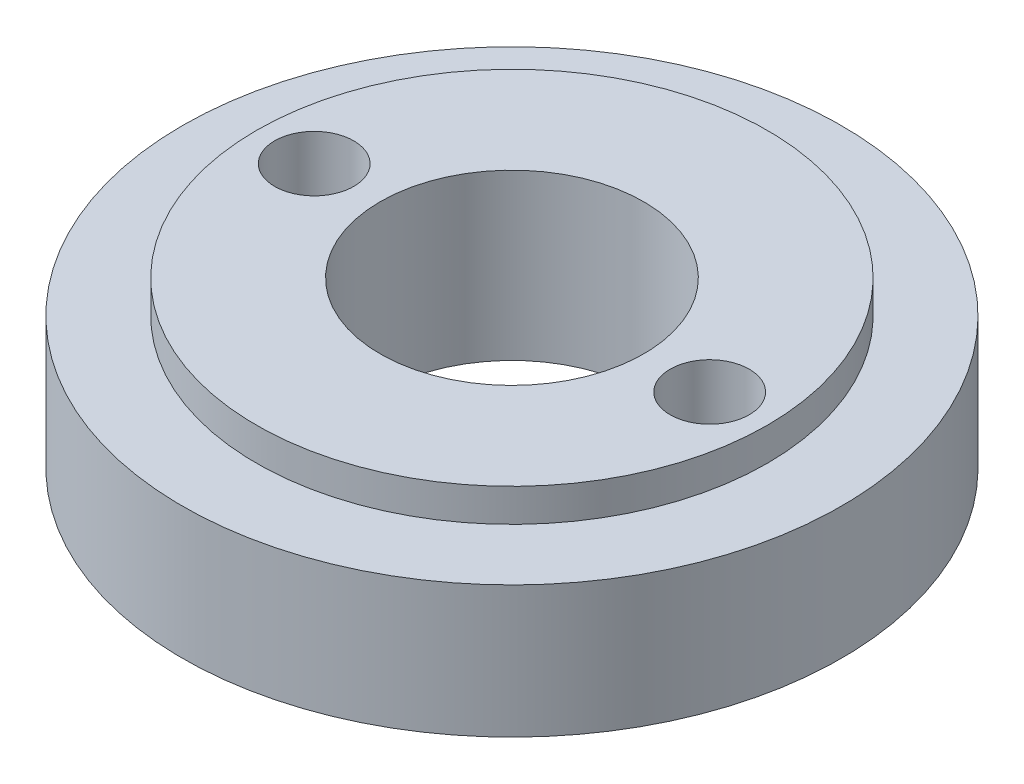
ISO-10303-21;
HEADER;
FILE_DESCRIPTION(('STEP AP214'),'2;1');
FILE_NAME('part.step','',(''),(''),'','','');
FILE_SCHEMA(('AUTOMOTIVE_DESIGN { 1 0 10303 214 1 1 1 1 }'));
ENDSEC;
DATA;
#1=APPLICATION_CONTEXT('core data for automotive mechanical design processes');
#2=APPLICATION_PROTOCOL_DEFINITION('international standard','automotive_design',2000,#1);
#3=PRODUCT_CONTEXT('',#1,'mechanical');
#4=PRODUCT('Part','Part','',(#3));
#5=PRODUCT_RELATED_PRODUCT_CATEGORY('part','',(#4));
#6=PRODUCT_DEFINITION_FORMATION('','',#4);
#7=PRODUCT_DEFINITION_CONTEXT('part definition',#1,'design');
#8=PRODUCT_DEFINITION('design','',#6,#7);
#9=PRODUCT_DEFINITION_SHAPE('','',#8);
#10=(LENGTH_UNIT() NAMED_UNIT(*) SI_UNIT(.MILLI.,.METRE.));
#11=(NAMED_UNIT(*) PLANE_ANGLE_UNIT() SI_UNIT($,.RADIAN.));
#12=(NAMED_UNIT(*) SI_UNIT($,.STERADIAN.) SOLID_ANGLE_UNIT());
#13=UNCERTAINTY_MEASURE_WITH_UNIT(LENGTH_MEASURE(1.E-05),#10,'distance_accuracy_value','');
#14=(GEOMETRIC_REPRESENTATION_CONTEXT(3) GLOBAL_UNCERTAINTY_ASSIGNED_CONTEXT((#13)) GLOBAL_UNIT_ASSIGNED_CONTEXT((#10,
#11,#12)) REPRESENTATION_CONTEXT('',''));
#15=CARTESIAN_POINT('',(0.,0.,0.));
#16=DIRECTION('',(0.,0.,1.));
#17=DIRECTION('',(1.,0.,0.));
#18=AXIS2_PLACEMENT_3D('',#15,#16,#17);
#19=CARTESIAN_POINT('',(7.75,0.,0.));
#20=DIRECTION('',(0.,-1.,0.));
#21=DIRECTION('',(1.,0.,0.));
#22=AXIS2_PLACEMENT_3D('',#19,#20,#21);
#23=PLANE('',#22);
#24=CARTESIAN_POINT('',(-6.,0.,0.));
#25=DIRECTION('',(0.,1.,0.));
#26=DIRECTION('',(-1.,0.,0.));
#27=AXIS2_PLACEMENT_3D('',#24,#25,#26);
#28=CIRCLE('',#27,1.2);
#29=CARTESIAN_POINT('',(-7.2,0.,0.));
#30=VERTEX_POINT('',#29);
#31=EDGE_CURVE('E63',#30,#30,#28,.T.);
#32=ORIENTED_EDGE('',*,*,#31,.F.);
#33=EDGE_LOOP('',(#32));
#34=FACE_BOUND('',#33,.T.);
#35=CARTESIAN_POINT('',(6.,0.,0.));
#36=DIRECTION('',(0.,1.,0.));
#37=DIRECTION('',(-1.,0.,0.));
#38=AXIS2_PLACEMENT_3D('',#35,#36,#37);
#39=CIRCLE('',#38,1.2);
#40=CARTESIAN_POINT('',(4.8,0.,0.));
#41=VERTEX_POINT('',#40);
#42=EDGE_CURVE('E57',#41,#41,#39,.T.);
#43=ORIENTED_EDGE('',*,*,#42,.F.);
#44=EDGE_LOOP('',(#43));
#45=FACE_BOUND('',#44,.T.);
#46=CARTESIAN_POINT('',(0.,0.,0.));
#47=DIRECTION('',(0.,1.,0.));
#48=DIRECTION('',(-1.,0.,0.));
#49=AXIS2_PLACEMENT_3D('',#46,#47,#48);
#50=CIRCLE('',#49,4.);
#51=CARTESIAN_POINT('',(-4.,0.,0.));
#52=VERTEX_POINT('',#51);
#53=EDGE_CURVE('E10',#52,#52,#50,.T.);
#54=ORIENTED_EDGE('',*,*,#53,.F.);
#55=EDGE_LOOP('',(#54));
#56=FACE_BOUND('',#55,.T.);
#57=CARTESIAN_POINT('',(0.,0.,0.));
#58=DIRECTION('',(0.,1.,0.));
#59=DIRECTION('',(-1.,0.,0.));
#60=AXIS2_PLACEMENT_3D('',#57,#58,#59);
#61=CIRCLE('',#60,7.75);
#62=CARTESIAN_POINT('',(-7.75,0.,0.));
#63=VERTEX_POINT('',#62);
#64=EDGE_CURVE('E53',#63,#63,#61,.T.);
#65=ORIENTED_EDGE('',*,*,#64,.T.);
#66=EDGE_LOOP('',(#65));
#67=FACE_BOUND('',#66,.T.);
#68=ADVANCED_FACE('F31',(#34,#45,#56,#67),#23,.F.);
#69=CARTESIAN_POINT('',(0.,0.,0.));
#70=DIRECTION('',(0.,1.,0.));
#71=DIRECTION('',(-1.,0.,0.));
#72=AXIS2_PLACEMENT_3D('',#69,#70,#71);
#73=CYLINDRICAL_SURFACE('',#72,4.);
#74=CARTESIAN_POINT('',(0.,-5.,0.));
#75=DIRECTION('',(0.,1.,0.));
#76=DIRECTION('',(-1.,0.,0.));
#77=AXIS2_PLACEMENT_3D('',#74,#75,#76);
#78=CIRCLE('',#77,4.);
#79=CARTESIAN_POINT('',(-4.,-5.,0.));
#80=VERTEX_POINT('',#79);
#81=EDGE_CURVE('E37',#80,#80,#78,.T.);
#82=ORIENTED_EDGE('',*,*,#81,.F.);
#83=EDGE_LOOP('',(#82));
#84=FACE_BOUND('',#83,.T.);
#85=ORIENTED_EDGE('',*,*,#53,.T.);
#86=EDGE_LOOP('',(#85));
#87=FACE_BOUND('',#86,.T.);
#88=ADVANCED_FACE('F81',(#84,#87),#73,.F.);
#89=CARTESIAN_POINT('',(4.,-5.,0.));
#90=DIRECTION('',(0.,1.,0.));
#91=DIRECTION('',(-1.,0.,0.));
#92=AXIS2_PLACEMENT_3D('',#89,#90,#91);
#93=PLANE('',#92);
#94=CARTESIAN_POINT('',(-6.,-5.,0.));
#95=DIRECTION('',(0.,1.,0.));
#96=DIRECTION('',(-1.,0.,0.));
#97=AXIS2_PLACEMENT_3D('',#94,#95,#96);
#98=CIRCLE('',#97,1.2);
#99=CARTESIAN_POINT('',(-7.2,-5.,0.));
#100=VERTEX_POINT('',#99);
#101=EDGE_CURVE('E60',#100,#100,#98,.T.);
#102=ORIENTED_EDGE('',*,*,#101,.T.);
#103=EDGE_LOOP('',(#102));
#104=FACE_BOUND('',#103,.T.);
#105=CARTESIAN_POINT('',(6.,-5.,0.));
#106=DIRECTION('',(0.,1.,0.));
#107=DIRECTION('',(-1.,0.,0.));
#108=AXIS2_PLACEMENT_3D('',#105,#106,#107);
#109=CIRCLE('',#108,1.2);
#110=CARTESIAN_POINT('',(4.8,-5.,0.));
#111=VERTEX_POINT('',#110);
#112=EDGE_CURVE('E56',#111,#111,#109,.T.);
#113=ORIENTED_EDGE('',*,*,#112,.T.);
#114=EDGE_LOOP('',(#113));
#115=FACE_BOUND('',#114,.T.);
#116=CARTESIAN_POINT('',(0.,-5.,0.));
#117=DIRECTION('',(0.,1.,0.));
#118=DIRECTION('',(-1.,0.,0.));
#119=AXIS2_PLACEMENT_3D('',#116,#117,#118);
#120=CIRCLE('',#119,10.);
#121=CARTESIAN_POINT('',(-10.,-5.,0.));
#122=VERTEX_POINT('',#121);
#123=EDGE_CURVE('E41',#122,#122,#120,.T.);
#124=ORIENTED_EDGE('',*,*,#123,.F.);
#125=EDGE_LOOP('',(#124));
#126=FACE_BOUND('',#125,.T.);
#127=ORIENTED_EDGE('',*,*,#81,.T.);
#128=EDGE_LOOP('',(#127));
#129=FACE_BOUND('',#128,.T.);
#130=ADVANCED_FACE('F69',(#104,#115,#126,#129),#93,.F.);
#131=CARTESIAN_POINT('',(0.,0.,0.));
#132=DIRECTION('',(0.,1.,0.));
#133=DIRECTION('',(-1.,0.,0.));
#134=AXIS2_PLACEMENT_3D('',#131,#132,#133);
#135=CYLINDRICAL_SURFACE('',#134,10.);
#136=CARTESIAN_POINT('',(0.,-1.,0.));
#137=DIRECTION('',(0.,1.,0.));
#138=DIRECTION('',(-1.,0.,0.));
#139=AXIS2_PLACEMENT_3D('',#136,#137,#138);
#140=CIRCLE('',#139,10.);
#141=CARTESIAN_POINT('',(-10.,-1.,0.));
#142=VERTEX_POINT('',#141);
#143=EDGE_CURVE('E45',#142,#142,#140,.T.);
#144=ORIENTED_EDGE('',*,*,#143,.F.);
#145=EDGE_LOOP('',(#144));
#146=FACE_BOUND('',#145,.T.);
#147=ORIENTED_EDGE('',*,*,#123,.T.);
#148=EDGE_LOOP('',(#147));
#149=FACE_BOUND('',#148,.T.);
#150=ADVANCED_FACE('F96',(#146,#149),#135,.T.);
#151=CARTESIAN_POINT('',(10.,-1.,0.));
#152=DIRECTION('',(0.,-1.,0.));
#153=DIRECTION('',(1.,0.,0.));
#154=AXIS2_PLACEMENT_3D('',#151,#152,#153);
#155=PLANE('',#154);
#156=CARTESIAN_POINT('',(0.,-1.,0.));
#157=DIRECTION('',(0.,1.,0.));
#158=DIRECTION('',(-1.,0.,0.));
#159=AXIS2_PLACEMENT_3D('',#156,#157,#158);
#160=CIRCLE('',#159,7.75);
#161=CARTESIAN_POINT('',(-7.75,-1.,0.));
#162=VERTEX_POINT('',#161);
#163=EDGE_CURVE('E50',#162,#162,#160,.T.);
#164=ORIENTED_EDGE('',*,*,#163,.F.);
#165=EDGE_LOOP('',(#164));
#166=FACE_BOUND('',#165,.T.);
#167=ORIENTED_EDGE('',*,*,#143,.T.);
#168=EDGE_LOOP('',(#167));
#169=FACE_BOUND('',#168,.T.);
#170=ADVANCED_FACE('F90',(#166,#169),#155,.F.);
#171=CARTESIAN_POINT('',(0.,0.,0.));
#172=DIRECTION('',(0.,1.,0.));
#173=DIRECTION('',(-1.,0.,0.));
#174=AXIS2_PLACEMENT_3D('',#171,#172,#173);
#175=CYLINDRICAL_SURFACE('',#174,7.75);
#176=ORIENTED_EDGE('',*,*,#64,.F.);
#177=EDGE_LOOP('',(#176));
#178=FACE_BOUND('',#177,.T.);
#179=ORIENTED_EDGE('',*,*,#163,.T.);
#180=EDGE_LOOP('',(#179));
#181=FACE_BOUND('',#180,.T.);
#182=ADVANCED_FACE('F87',(#178,#181),#175,.T.);
#183=CARTESIAN_POINT('',(6.,-5.,0.));
#184=DIRECTION('',(0.,1.,0.));
#185=DIRECTION('',(-1.,0.,0.));
#186=AXIS2_PLACEMENT_3D('',#183,#184,#185);
#187=CYLINDRICAL_SURFACE('',#186,1.2);
#188=ORIENTED_EDGE('',*,*,#112,.F.);
#189=EDGE_LOOP('',(#188));
#190=FACE_BOUND('',#189,.T.);
#191=ORIENTED_EDGE('',*,*,#42,.T.);
#192=EDGE_LOOP('',(#191));
#193=FACE_BOUND('',#192,.T.);
#194=ADVANCED_FACE('F75',(#190,#193),#187,.F.);
#195=CARTESIAN_POINT('',(-6.,-5.,0.));
#196=DIRECTION('',(0.,1.,0.));
#197=DIRECTION('',(-1.,0.,0.));
#198=AXIS2_PLACEMENT_3D('',#195,#196,#197);
#199=CYLINDRICAL_SURFACE('',#198,1.2);
#200=ORIENTED_EDGE('',*,*,#101,.F.);
#201=EDGE_LOOP('',(#200));
#202=FACE_BOUND('',#201,.T.);
#203=ORIENTED_EDGE('',*,*,#31,.T.);
#204=EDGE_LOOP('',(#203));
#205=FACE_BOUND('',#204,.T.);
#206=ADVANCED_FACE('F72',(#202,#205),#199,.F.);
#207=CLOSED_SHELL('',(#68,#88,#130,#150,#170,#182,#194,#206));
#208=MANIFOLD_SOLID_BREP('B2',#207);
#209=ADVANCED_BREP_SHAPE_REPRESENTATION('',(#18,#208),#14);
#210=SHAPE_DEFINITION_REPRESENTATION(#9,#209);
ENDSEC;
END-ISO-10303-21;
